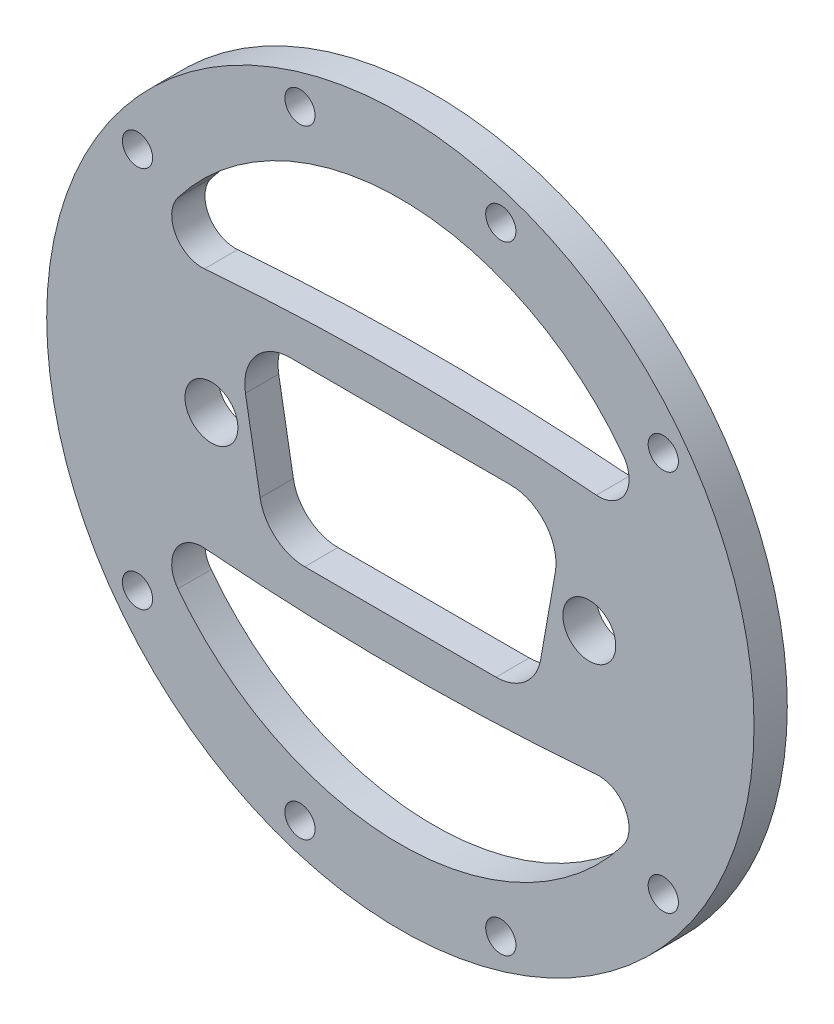
ISO-10303-21;
HEADER;
FILE_DESCRIPTION(('STEP AP214'),'2;1');
FILE_NAME('part.step','',(''),(''),'','','');
FILE_SCHEMA(('AUTOMOTIVE_DESIGN { 1 0 10303 214 1 1 1 1 }'));
ENDSEC;
DATA;
#1=APPLICATION_CONTEXT('core data for automotive mechanical design processes');
#2=APPLICATION_PROTOCOL_DEFINITION('international standard','automotive_design',2000,#1);
#3=PRODUCT_CONTEXT('',#1,'mechanical');
#4=PRODUCT('Part','Part','',(#3));
#5=PRODUCT_RELATED_PRODUCT_CATEGORY('part','',(#4));
#6=PRODUCT_DEFINITION_FORMATION('','',#4);
#7=PRODUCT_DEFINITION_CONTEXT('part definition',#1,'design');
#8=PRODUCT_DEFINITION('design','',#6,#7);
#9=PRODUCT_DEFINITION_SHAPE('','',#8);
#10=(LENGTH_UNIT() NAMED_UNIT(*) SI_UNIT(.MILLI.,.METRE.));
#11=(NAMED_UNIT(*) PLANE_ANGLE_UNIT() SI_UNIT($,.RADIAN.));
#12=(NAMED_UNIT(*) SI_UNIT($,.STERADIAN.) SOLID_ANGLE_UNIT());
#13=UNCERTAINTY_MEASURE_WITH_UNIT(LENGTH_MEASURE(1.E-05),#10,'distance_accuracy_value','');
#14=(GEOMETRIC_REPRESENTATION_CONTEXT(3) GLOBAL_UNCERTAINTY_ASSIGNED_CONTEXT((#13)) GLOBAL_UNIT_ASSIGNED_CONTEXT((#10,
#11,#12)) REPRESENTATION_CONTEXT('',''));
#15=CARTESIAN_POINT('',(0.,0.,0.));
#16=DIRECTION('',(0.,0.,1.));
#17=DIRECTION('',(1.,0.,0.));
#18=AXIS2_PLACEMENT_3D('',#15,#16,#17);
#19=CARTESIAN_POINT('',(0.,0.,2.2));
#20=DIRECTION('',(0.,0.,1.));
#21=DIRECTION('',(1.,0.,0.));
#22=AXIS2_PLACEMENT_3D('',#19,#20,#21);
#23=PLANE('',#22);
#24=CARTESIAN_POINT('',(7.29557674096338,2.75,2.2));
#25=DIRECTION('',(0.,0.,1.));
#26=DIRECTION('',(-1.,0.,0.));
#27=AXIS2_PLACEMENT_3D('',#24,#25,#26);
#28=CIRCLE('',#27,3.);
#29=CARTESIAN_POINT('',(10.25,2.2290554669992,2.2));
#30=VERTEX_POINT('',#29);
#31=CARTESIAN_POINT('',(7.29557674096338,5.75,2.2));
#32=VERTEX_POINT('',#31);
#33=EDGE_CURVE('E55',#30,#32,#28,.T.);
#34=ORIENTED_EDGE('',*,*,#33,.F.);
#35=DIRECTION('',(0.173648177666934,0.984807753012207,0.));
#36=VECTOR('',#35,1.);
#37=CARTESIAN_POINT('',(10.25,2.2290554669992,2.2));
#38=LINE('',#37,#36);
#39=CARTESIAN_POINT('',(9.28020160610342,-3.2709445330008,2.2));
#40=VERTEX_POINT('',#39);
#41=EDGE_CURVE('E175',#40,#30,#38,.T.);
#42=ORIENTED_EDGE('',*,*,#41,.F.);
#43=CARTESIAN_POINT('',(6.3257783470668,-2.75,2.2));
#44=DIRECTION('',(0.,0.,1.));
#45=DIRECTION('',(1.,0.,0.));
#46=AXIS2_PLACEMENT_3D('',#43,#44,#45);
#47=CIRCLE('',#46,3.);
#48=CARTESIAN_POINT('',(6.3257783470668,-5.75,2.2));
#49=VERTEX_POINT('',#48);
#50=EDGE_CURVE('E179',#49,#40,#47,.T.);
#51=ORIENTED_EDGE('',*,*,#50,.F.);
#52=DIRECTION('',(1.,0.,0.));
#53=VECTOR('',#52,1.);
#54=CARTESIAN_POINT('',(-6.3257783470668,-5.75,2.2));
#55=LINE('',#54,#53);
#56=CARTESIAN_POINT('',(-6.3257783470668,-5.75,2.2));
#57=VERTEX_POINT('',#56);
#58=EDGE_CURVE('E218',#57,#49,#55,.T.);
#59=ORIENTED_EDGE('',*,*,#58,.F.);
#60=CARTESIAN_POINT('',(-6.3257783470668,-2.75,2.2));
#61=DIRECTION('',(0.,0.,1.));
#62=DIRECTION('',(1.,0.,0.));
#63=AXIS2_PLACEMENT_3D('',#60,#61,#62);
#64=CIRCLE('',#63,3.);
#65=CARTESIAN_POINT('',(-9.28020160610342,-3.2709445330008,2.2));
#66=VERTEX_POINT('',#65);
#67=EDGE_CURVE('E214',#66,#57,#64,.T.);
#68=ORIENTED_EDGE('',*,*,#67,.F.);
#69=DIRECTION('',(0.173648177666934,-0.984807753012207,0.));
#70=VECTOR('',#69,1.);
#71=CARTESIAN_POINT('',(-10.25,2.2290554669992,2.2));
#72=LINE('',#71,#70);
#73=CARTESIAN_POINT('',(-10.25,2.2290554669992,2.2));
#74=VERTEX_POINT('',#73);
#75=EDGE_CURVE('E210',#74,#66,#72,.T.);
#76=ORIENTED_EDGE('',*,*,#75,.F.);
#77=CARTESIAN_POINT('',(-7.29557674096338,2.75,2.2));
#78=DIRECTION('',(0.,0.,1.));
#79=DIRECTION('',(1.,0.,0.));
#80=AXIS2_PLACEMENT_3D('',#77,#78,#79);
#81=CIRCLE('',#80,3.);
#82=CARTESIAN_POINT('',(-7.29557674096338,5.75,2.2));
#83=VERTEX_POINT('',#82);
#84=EDGE_CURVE('E206',#83,#74,#81,.T.);
#85=ORIENTED_EDGE('',*,*,#84,.F.);
#86=DIRECTION('',(-1.,0.,0.));
#87=VECTOR('',#86,1.);
#88=CARTESIAN_POINT('',(-7.29557674096338,5.75,2.2));
#89=LINE('',#88,#87);
#90=EDGE_CURVE('E203',#32,#83,#89,.T.);
#91=ORIENTED_EDGE('',*,*,#90,.F.);
#92=EDGE_LOOP('',(#34,#42,#51,#59,#68,#76,#85,#91));
#93=FACE_BOUND('',#92,.T.);
#94=CARTESIAN_POINT('',(-12.5,0.,2.2));
#95=DIRECTION('',(0.,0.,1.));
#96=DIRECTION('',(-1.,0.,0.));
#97=AXIS2_PLACEMENT_3D('',#94,#95,#96);
#98=CIRCLE('',#97,1.75);
#99=CARTESIAN_POINT('',(-14.25,0.,2.2));
#100=VERTEX_POINT('',#99);
#101=EDGE_CURVE('E228',#100,#100,#98,.T.);
#102=ORIENTED_EDGE('',*,*,#101,.F.);
#103=EDGE_LOOP('',(#102));
#104=FACE_BOUND('',#103,.T.);
#105=CARTESIAN_POINT('',(12.5,0.,2.2));
#106=DIRECTION('',(0.,0.,1.));
#107=DIRECTION('',(1.,0.,0.));
#108=AXIS2_PLACEMENT_3D('',#105,#106,#107);
#109=CIRCLE('',#108,1.75);
#110=CARTESIAN_POINT('',(14.25,0.,2.2));
#111=VERTEX_POINT('',#110);
#112=EDGE_CURVE('E250',#111,#111,#109,.T.);
#113=ORIENTED_EDGE('',*,*,#112,.F.);
#114=EDGE_LOOP('',(#113));
#115=FACE_BOUND('',#114,.T.);
#116=CARTESIAN_POINT('',(-17.3938653790616,-12.6373829242879,2.2));
#117=DIRECTION('',(0.,0.,1.));
#118=DIRECTION('',(1.,0.,0.));
#119=AXIS2_PLACEMENT_3D('',#116,#117,#118);
#120=CIRCLE('',#119,1.);
#121=CARTESIAN_POINT('',(-16.3938653790616,-12.6373829242879,2.2));
#122=VERTEX_POINT('',#121);
#123=EDGE_CURVE('E270',#122,#122,#120,.T.);
#124=ORIENTED_EDGE('',*,*,#123,.F.);
#125=EDGE_LOOP('',(#124));
#126=FACE_BOUND('',#125,.T.);
#127=CARTESIAN_POINT('',(6.6438653790611,-20.4477151003459,2.2));
#128=DIRECTION('',(0.,0.,1.));
#129=DIRECTION('',(1.,0.,0.));
#130=AXIS2_PLACEMENT_3D('',#127,#128,#129);
#131=CIRCLE('',#130,1.);
#132=CARTESIAN_POINT('',(7.6438653790611,-20.4477151003459,2.2));
#133=VERTEX_POINT('',#132);
#134=EDGE_CURVE('E286',#133,#133,#131,.T.);
#135=ORIENTED_EDGE('',*,*,#134,.F.);
#136=EDGE_LOOP('',(#135));
#137=FACE_BOUND('',#136,.T.);
#138=CARTESIAN_POINT('',(17.3938653790615,12.637382924288,2.2));
#139=DIRECTION('',(0.,0.,1.));
#140=DIRECTION('',(1.,0.,0.));
#141=AXIS2_PLACEMENT_3D('',#138,#139,#140);
#142=CIRCLE('',#141,1.);
#143=CARTESIAN_POINT('',(18.3938653790615,12.637382924288,2.2));
#144=VERTEX_POINT('',#143);
#145=EDGE_CURVE('E302',#144,#144,#142,.T.);
#146=ORIENTED_EDGE('',*,*,#145,.F.);
#147=EDGE_LOOP('',(#146));
#148=FACE_BOUND('',#147,.T.);
#149=CARTESIAN_POINT('',(6.64386537906153,20.4477151003458,2.2));
#150=DIRECTION('',(0.,0.,1.));
#151=DIRECTION('',(1.,0.,0.));
#152=AXIS2_PLACEMENT_3D('',#149,#150,#151);
#153=CIRCLE('',#152,0.999999999999999);
#154=CARTESIAN_POINT('',(7.64386537906152,20.4477151003458,2.2));
#155=VERTEX_POINT('',#154);
#156=EDGE_CURVE('E318',#155,#155,#153,.T.);
#157=ORIENTED_EDGE('',*,*,#156,.F.);
#158=EDGE_LOOP('',(#157));
#159=FACE_BOUND('',#158,.T.);
#160=CARTESIAN_POINT('',(0.,0.,2.2));
#161=DIRECTION('',(0.,0.,1.));
#162=DIRECTION('',(1.,0.,0.));
#163=AXIS2_PLACEMENT_3D('',#160,#161,#162);
#164=CIRCLE('',#163,23.4);
#165=CARTESIAN_POINT('',(23.4,0.,2.2));
#166=VERTEX_POINT('',#165);
#167=EDGE_CURVE('E11',#166,#166,#164,.T.);
#168=ORIENTED_EDGE('',*,*,#167,.T.);
#169=EDGE_LOOP('',(#168));
#170=FACE_BOUND('',#169,.T.);
#171=CARTESIAN_POINT('',(13.12941512368,9.99342076118538,2.2));
#172=DIRECTION('',(0.,0.,1.));
#173=DIRECTION('',(1.,0.,0.));
#174=AXIS2_PLACEMENT_3D('',#171,#172,#173);
#175=CIRCLE('',#174,1.99999999999987);
#176=CARTESIAN_POINT('',(12.9673235789432,8.00000000000015,2.2));
#177=VERTEX_POINT('',#176);
#178=CARTESIAN_POINT('',(14.7208593810955,11.2047444898137,2.2));
#179=VERTEX_POINT('',#178);
#180=EDGE_CURVE('E372',#177,#179,#175,.T.);
#181=ORIENTED_EDGE('',*,*,#180,.F.);
#182=CARTESIAN_POINT('',(0.,-151.473660894829,2.2));
#183=DIRECTION('',(0.,0.,-1.));
#184=DIRECTION('',(-1.,0.,0.));
#185=AXIS2_PLACEMENT_3D('',#182,#183,#184);
#186=CIRCLE('',#185,160.);
#187=CARTESIAN_POINT('',(-12.9673235789432,8.00000000000015,2.2));
#188=VERTEX_POINT('',#187);
#189=EDGE_CURVE('E369',#188,#177,#186,.T.);
#190=ORIENTED_EDGE('',*,*,#189,.F.);
#191=CARTESIAN_POINT('',(-13.12941512368,9.99342076118538,2.2));
#192=DIRECTION('',(0.,0.,1.));
#193=DIRECTION('',(-1.,0.,0.));
#194=AXIS2_PLACEMENT_3D('',#191,#192,#193);
#195=CIRCLE('',#194,1.99999999999987);
#196=CARTESIAN_POINT('',(-14.7208593810956,11.2047444898138,2.2));
#197=VERTEX_POINT('',#196);
#198=EDGE_CURVE('E380',#197,#188,#195,.T.);
#199=ORIENTED_EDGE('',*,*,#198,.F.);
#200=CARTESIAN_POINT('',(0.,0.,2.2));
#201=DIRECTION('',(0.,0.,1.));
#202=DIRECTION('',(1.,0.,0.));
#203=AXIS2_PLACEMENT_3D('',#200,#201,#202);
#204=CIRCLE('',#203,18.5);
#205=EDGE_CURVE('E376',#179,#197,#204,.T.);
#206=ORIENTED_EDGE('',*,*,#205,.F.);
#207=EDGE_LOOP('',(#181,#190,#199,#206));
#208=FACE_BOUND('',#207,.T.);
#209=CARTESIAN_POINT('',(-13.12941512368,-9.99342076118538,2.2));
#210=DIRECTION('',(0.,0.,1.));
#211=DIRECTION('',(1.,0.,0.));
#212=AXIS2_PLACEMENT_3D('',#209,#210,#211);
#213=CIRCLE('',#212,1.99999999999987);
#214=CARTESIAN_POINT('',(-12.9673235789432,-8.00000000000015,2.2));
#215=VERTEX_POINT('',#214);
#216=CARTESIAN_POINT('',(-14.7208593810956,-11.2047444898138,2.2));
#217=VERTEX_POINT('',#216);
#218=EDGE_CURVE('E329',#215,#217,#213,.T.);
#219=ORIENTED_EDGE('',*,*,#218,.F.);
#220=CARTESIAN_POINT('',(0.,151.473660894829,2.2));
#221=DIRECTION('',(0.,0.,-1.));
#222=DIRECTION('',(1.,0.,0.));
#223=AXIS2_PLACEMENT_3D('',#220,#221,#222);
#224=CIRCLE('',#223,160.);
#225=CARTESIAN_POINT('',(12.9673235789432,-8.00000000000015,2.2));
#226=VERTEX_POINT('',#225);
#227=EDGE_CURVE('E326',#226,#215,#224,.T.);
#228=ORIENTED_EDGE('',*,*,#227,.F.);
#229=CARTESIAN_POINT('',(13.12941512368,-9.99342076118538,2.2));
#230=DIRECTION('',(0.,0.,1.));
#231=DIRECTION('',(-1.,0.,0.));
#232=AXIS2_PLACEMENT_3D('',#229,#230,#231);
#233=CIRCLE('',#232,1.99999999999987);
#234=CARTESIAN_POINT('',(14.7208593810956,-11.2047444898138,2.2));
#235=VERTEX_POINT('',#234);
#236=EDGE_CURVE('E337',#235,#226,#233,.T.);
#237=ORIENTED_EDGE('',*,*,#236,.F.);
#238=CARTESIAN_POINT('',(0.,0.,2.2));
#239=DIRECTION('',(0.,0.,1.));
#240=DIRECTION('',(1.,0.,0.));
#241=AXIS2_PLACEMENT_3D('',#238,#239,#240);
#242=CIRCLE('',#241,18.5);
#243=EDGE_CURVE('E333',#217,#235,#242,.T.);
#244=ORIENTED_EDGE('',*,*,#243,.F.);
#245=EDGE_LOOP('',(#219,#228,#237,#244));
#246=FACE_BOUND('',#245,.T.);
#247=CARTESIAN_POINT('',(-6.64386537906124,20.4477151003458,2.2));
#248=DIRECTION('',(0.,0.,1.));
#249=DIRECTION('',(1.,0.,0.));
#250=AXIS2_PLACEMENT_3D('',#247,#248,#249);
#251=CIRCLE('',#250,1.);
#252=CARTESIAN_POINT('',(-5.64386537906124,20.4477151003458,2.2));
#253=VERTEX_POINT('',#252);
#254=EDGE_CURVE('E310',#253,#253,#251,.T.);
#255=ORIENTED_EDGE('',*,*,#254,.F.);
#256=EDGE_LOOP('',(#255));
#257=FACE_BOUND('',#256,.T.);
#258=CARTESIAN_POINT('',(17.3938653790612,-12.6373829242884,2.2));
#259=DIRECTION('',(0.,0.,1.));
#260=DIRECTION('',(1.,0.,0.));
#261=AXIS2_PLACEMENT_3D('',#258,#259,#260);
#262=CIRCLE('',#261,1.);
#263=CARTESIAN_POINT('',(18.3938653790612,-12.6373829242884,2.2));
#264=VERTEX_POINT('',#263);
#265=EDGE_CURVE('E294',#264,#264,#262,.T.);
#266=ORIENTED_EDGE('',*,*,#265,.F.);
#267=EDGE_LOOP('',(#266));
#268=FACE_BOUND('',#267,.T.);
#269=CARTESIAN_POINT('',(-6.64386537906167,-20.4477151003457,2.2));
#270=DIRECTION('',(0.,0.,1.));
#271=DIRECTION('',(1.,0.,0.));
#272=AXIS2_PLACEMENT_3D('',#269,#270,#271);
#273=CIRCLE('',#272,1.);
#274=CARTESIAN_POINT('',(-5.64386537906167,-20.4477151003457,2.2));
#275=VERTEX_POINT('',#274);
#276=EDGE_CURVE('E278',#275,#275,#273,.T.);
#277=ORIENTED_EDGE('',*,*,#276,.F.);
#278=EDGE_LOOP('',(#277));
#279=FACE_BOUND('',#278,.T.);
#280=CARTESIAN_POINT('',(-17.3938653790611,12.6373829242885,2.2));
#281=DIRECTION('',(0.,0.,1.));
#282=DIRECTION('',(1.,0.,0.));
#283=AXIS2_PLACEMENT_3D('',#280,#281,#282);
#284=CIRCLE('',#283,1.00000000000001);
#285=CARTESIAN_POINT('',(-16.3938653790611,12.6373829242885,2.2));
#286=VERTEX_POINT('',#285);
#287=EDGE_CURVE('E262',#286,#286,#284,.T.);
#288=ORIENTED_EDGE('',*,*,#287,.F.);
#289=EDGE_LOOP('',(#288));
#290=FACE_BOUND('',#289,.T.);
#291=ADVANCED_FACE('F39',(#93,#104,#115,#126,#137,#148,#159,#170,#208,#246,#257,#268,#279,#290),
#23,.T.);
#292=CARTESIAN_POINT('',(0.,0.,0.));
#293=DIRECTION('',(0.,0.,1.));
#294=DIRECTION('',(1.,0.,0.));
#295=AXIS2_PLACEMENT_3D('',#292,#293,#294);
#296=PLANE('',#295);
#297=DIRECTION('',(0.173648177666934,0.984807753012207,0.));
#298=VECTOR('',#297,1.);
#299=CARTESIAN_POINT('',(10.25,2.2290554669992,0.));
#300=LINE('',#299,#298);
#301=CARTESIAN_POINT('',(9.28020160610342,-3.2709445330008,0.));
#302=VERTEX_POINT('',#301);
#303=CARTESIAN_POINT('',(10.25,2.2290554669992,0.));
#304=VERTEX_POINT('',#303);
#305=EDGE_CURVE('E162',#302,#304,#300,.T.);
#306=ORIENTED_EDGE('',*,*,#305,.T.);
#307=CARTESIAN_POINT('',(7.29557674096338,2.75,0.));
#308=DIRECTION('',(0.,0.,1.));
#309=DIRECTION('',(-1.,0.,0.));
#310=AXIS2_PLACEMENT_3D('',#307,#308,#309);
#311=CIRCLE('',#310,3.);
#312=CARTESIAN_POINT('',(7.29557674096338,5.75,0.));
#313=VERTEX_POINT('',#312);
#314=EDGE_CURVE('E155',#304,#313,#311,.T.);
#315=ORIENTED_EDGE('',*,*,#314,.T.);
#316=DIRECTION('',(-1.,0.,0.));
#317=VECTOR('',#316,1.);
#318=CARTESIAN_POINT('',(-7.29557674096338,5.75,0.));
#319=LINE('',#318,#317);
#320=CARTESIAN_POINT('',(-7.29557674096338,5.75,0.));
#321=VERTEX_POINT('',#320);
#322=EDGE_CURVE('E165',#313,#321,#319,.T.);
#323=ORIENTED_EDGE('',*,*,#322,.T.);
#324=CARTESIAN_POINT('',(-7.29557674096338,2.75,0.));
#325=DIRECTION('',(0.,0.,1.));
#326=DIRECTION('',(1.,0.,0.));
#327=AXIS2_PLACEMENT_3D('',#324,#325,#326);
#328=CIRCLE('',#327,3.);
#329=CARTESIAN_POINT('',(-10.25,2.2290554669992,0.));
#330=VERTEX_POINT('',#329);
#331=EDGE_CURVE('E63',#321,#330,#328,.T.);
#332=ORIENTED_EDGE('',*,*,#331,.T.);
#333=DIRECTION('',(0.173648177666934,-0.984807753012207,0.));
#334=VECTOR('',#333,1.);
#335=CARTESIAN_POINT('',(-10.25,2.2290554669992,0.));
#336=LINE('',#335,#334);
#337=CARTESIAN_POINT('',(-9.28020160610342,-3.2709445330008,0.));
#338=VERTEX_POINT('',#337);
#339=EDGE_CURVE('E184',#330,#338,#336,.T.);
#340=ORIENTED_EDGE('',*,*,#339,.T.);
#341=CARTESIAN_POINT('',(-6.3257783470668,-2.75,0.));
#342=DIRECTION('',(0.,0.,1.));
#343=DIRECTION('',(1.,0.,0.));
#344=AXIS2_PLACEMENT_3D('',#341,#342,#343);
#345=CIRCLE('',#344,3.);
#346=CARTESIAN_POINT('',(-6.3257783470668,-5.75,0.));
#347=VERTEX_POINT('',#346);
#348=EDGE_CURVE('E188',#338,#347,#345,.T.);
#349=ORIENTED_EDGE('',*,*,#348,.T.);
#350=DIRECTION('',(1.,0.,0.));
#351=VECTOR('',#350,1.);
#352=CARTESIAN_POINT('',(-6.3257783470668,-5.75,0.));
#353=LINE('',#352,#351);
#354=CARTESIAN_POINT('',(6.3257783470668,-5.75,0.));
#355=VERTEX_POINT('',#354);
#356=EDGE_CURVE('E192',#347,#355,#353,.T.);
#357=ORIENTED_EDGE('',*,*,#356,.T.);
#358=CARTESIAN_POINT('',(6.3257783470668,-2.75,0.));
#359=DIRECTION('',(0.,0.,1.));
#360=DIRECTION('',(1.,0.,0.));
#361=AXIS2_PLACEMENT_3D('',#358,#359,#360);
#362=CIRCLE('',#361,3.);
#363=EDGE_CURVE('E196',#355,#302,#362,.T.);
#364=ORIENTED_EDGE('',*,*,#363,.T.);
#365=EDGE_LOOP('',(#306,#315,#323,#332,#340,#349,#357,#364));
#366=FACE_BOUND('',#365,.T.);
#367=CARTESIAN_POINT('',(-12.5,0.,0.));
#368=DIRECTION('',(0.,0.,1.));
#369=DIRECTION('',(-1.,0.,0.));
#370=AXIS2_PLACEMENT_3D('',#367,#368,#369);
#371=CIRCLE('',#370,1.75);
#372=CARTESIAN_POINT('',(-14.25,0.,0.));
#373=VERTEX_POINT('',#372);
#374=EDGE_CURVE('E246',#373,#373,#371,.T.);
#375=ORIENTED_EDGE('',*,*,#374,.T.);
#376=EDGE_LOOP('',(#375));
#377=FACE_BOUND('',#376,.T.);
#378=CARTESIAN_POINT('',(12.5,0.,0.));
#379=DIRECTION('',(0.,0.,1.));
#380=DIRECTION('',(1.,0.,0.));
#381=AXIS2_PLACEMENT_3D('',#378,#379,#380);
#382=CIRCLE('',#381,1.75);
#383=CARTESIAN_POINT('',(14.25,0.,0.));
#384=VERTEX_POINT('',#383);
#385=EDGE_CURVE('E254',#384,#384,#382,.T.);
#386=ORIENTED_EDGE('',*,*,#385,.T.);
#387=EDGE_LOOP('',(#386));
#388=FACE_BOUND('',#387,.T.);
#389=CARTESIAN_POINT('',(0.,-151.473660894829,0.));
#390=DIRECTION('',(0.,0.,-1.));
#391=DIRECTION('',(-1.,0.,0.));
#392=AXIS2_PLACEMENT_3D('',#389,#390,#391);
#393=CIRCLE('',#392,160.);
#394=CARTESIAN_POINT('',(-12.9673235789432,8.00000000000015,0.));
#395=VERTEX_POINT('',#394);
#396=CARTESIAN_POINT('',(12.9673235789432,8.00000000000015,0.));
#397=VERTEX_POINT('',#396);
#398=EDGE_CURVE('E368',#395,#397,#393,.T.);
#399=ORIENTED_EDGE('',*,*,#398,.T.);
#400=CARTESIAN_POINT('',(13.12941512368,9.99342076118538,0.));
#401=DIRECTION('',(0.,0.,1.));
#402=DIRECTION('',(1.,0.,0.));
#403=AXIS2_PLACEMENT_3D('',#400,#401,#402);
#404=CIRCLE('',#403,1.99999999999987);
#405=CARTESIAN_POINT('',(14.7208593810955,11.2047444898137,0.));
#406=VERTEX_POINT('',#405);
#407=EDGE_CURVE('E387',#397,#406,#404,.T.);
#408=ORIENTED_EDGE('',*,*,#407,.T.);
#409=CARTESIAN_POINT('',(0.,0.,0.));
#410=DIRECTION('',(0.,0.,1.));
#411=DIRECTION('',(1.,0.,0.));
#412=AXIS2_PLACEMENT_3D('',#409,#410,#411);
#413=CIRCLE('',#412,18.5);
#414=CARTESIAN_POINT('',(-14.7208593810956,11.2047444898138,0.));
#415=VERTEX_POINT('',#414);
#416=EDGE_CURVE('E391',#406,#415,#413,.T.);
#417=ORIENTED_EDGE('',*,*,#416,.T.);
#418=CARTESIAN_POINT('',(-13.12941512368,9.99342076118538,0.));
#419=DIRECTION('',(0.,0.,1.));
#420=DIRECTION('',(-1.,0.,0.));
#421=AXIS2_PLACEMENT_3D('',#418,#419,#420);
#422=CIRCLE('',#421,1.99999999999987);
#423=EDGE_CURVE('E373',#415,#395,#422,.T.);
#424=ORIENTED_EDGE('',*,*,#423,.T.);
#425=EDGE_LOOP('',(#399,#408,#417,#424));
#426=FACE_BOUND('',#425,.T.);
#427=CARTESIAN_POINT('',(0.,0.,0.));
#428=DIRECTION('',(0.,0.,1.));
#429=DIRECTION('',(1.,0.,0.));
#430=AXIS2_PLACEMENT_3D('',#427,#428,#429);
#431=CIRCLE('',#430,23.4);
#432=CARTESIAN_POINT('',(23.4,0.,0.));
#433=VERTEX_POINT('',#432);
#434=EDGE_CURVE('E43',#433,#433,#431,.T.);
#435=ORIENTED_EDGE('',*,*,#434,.F.);
#436=EDGE_LOOP('',(#435));
#437=FACE_BOUND('',#436,.T.);
#438=CARTESIAN_POINT('',(0.,151.473660894829,0.));
#439=DIRECTION('',(0.,0.,-1.));
#440=DIRECTION('',(1.,0.,0.));
#441=AXIS2_PLACEMENT_3D('',#438,#439,#440);
#442=CIRCLE('',#441,160.);
#443=CARTESIAN_POINT('',(12.9673235789432,-8.00000000000015,0.));
#444=VERTEX_POINT('',#443);
#445=CARTESIAN_POINT('',(-12.9673235789432,-8.00000000000015,0.));
#446=VERTEX_POINT('',#445);
#447=EDGE_CURVE('E322',#444,#446,#442,.T.);
#448=ORIENTED_EDGE('',*,*,#447,.T.);
#449=CARTESIAN_POINT('',(-13.12941512368,-9.99342076118538,0.));
#450=DIRECTION('',(0.,0.,1.));
#451=DIRECTION('',(1.,0.,0.));
#452=AXIS2_PLACEMENT_3D('',#449,#450,#451);
#453=CIRCLE('',#452,1.99999999999987);
#454=CARTESIAN_POINT('',(-14.7208593810956,-11.2047444898138,0.));
#455=VERTEX_POINT('',#454);
#456=EDGE_CURVE('E344',#446,#455,#453,.T.);
#457=ORIENTED_EDGE('',*,*,#456,.T.);
#458=CARTESIAN_POINT('',(0.,0.,0.));
#459=DIRECTION('',(0.,0.,1.));
#460=DIRECTION('',(1.,0.,0.));
#461=AXIS2_PLACEMENT_3D('',#458,#459,#460);
#462=CIRCLE('',#461,18.5);
#463=CARTESIAN_POINT('',(14.7208593810955,-11.2047444898137,0.));
#464=VERTEX_POINT('',#463);
#465=EDGE_CURVE('E348',#455,#464,#462,.T.);
#466=ORIENTED_EDGE('',*,*,#465,.T.);
#467=CARTESIAN_POINT('',(13.12941512368,-9.99342076118538,0.));
#468=DIRECTION('',(0.,0.,1.));
#469=DIRECTION('',(-1.,0.,0.));
#470=AXIS2_PLACEMENT_3D('',#467,#468,#469);
#471=CIRCLE('',#470,1.99999999999987);
#472=EDGE_CURVE('E330',#464,#444,#471,.T.);
#473=ORIENTED_EDGE('',*,*,#472,.T.);
#474=EDGE_LOOP('',(#448,#457,#466,#473));
#475=FACE_BOUND('',#474,.T.);
#476=CARTESIAN_POINT('',(6.64386537906153,20.4477151003458,0.));
#477=DIRECTION('',(0.,0.,1.));
#478=DIRECTION('',(1.,0.,0.));
#479=AXIS2_PLACEMENT_3D('',#476,#477,#478);
#480=CIRCLE('',#479,0.999999999999999);
#481=CARTESIAN_POINT('',(7.64386537906152,20.4477151003458,0.));
#482=VERTEX_POINT('',#481);
#483=EDGE_CURVE('E314',#482,#482,#480,.T.);
#484=ORIENTED_EDGE('',*,*,#483,.T.);
#485=EDGE_LOOP('',(#484));
#486=FACE_BOUND('',#485,.T.);
#487=CARTESIAN_POINT('',(-6.64386537906124,20.4477151003458,0.));
#488=DIRECTION('',(0.,0.,1.));
#489=DIRECTION('',(1.,0.,0.));
#490=AXIS2_PLACEMENT_3D('',#487,#488,#489);
#491=CIRCLE('',#490,1.);
#492=CARTESIAN_POINT('',(-5.64386537906124,20.4477151003458,0.));
#493=VERTEX_POINT('',#492);
#494=EDGE_CURVE('E306',#493,#493,#491,.T.);
#495=ORIENTED_EDGE('',*,*,#494,.T.);
#496=EDGE_LOOP('',(#495));
#497=FACE_BOUND('',#496,.T.);
#498=CARTESIAN_POINT('',(17.3938653790615,12.637382924288,0.));
#499=DIRECTION('',(0.,0.,1.));
#500=DIRECTION('',(1.,0.,0.));
#501=AXIS2_PLACEMENT_3D('',#498,#499,#500);
#502=CIRCLE('',#501,1.);
#503=CARTESIAN_POINT('',(18.3938653790615,12.637382924288,0.));
#504=VERTEX_POINT('',#503);
#505=EDGE_CURVE('E298',#504,#504,#502,.T.);
#506=ORIENTED_EDGE('',*,*,#505,.T.);
#507=EDGE_LOOP('',(#506));
#508=FACE_BOUND('',#507,.T.);
#509=CARTESIAN_POINT('',(17.3938653790612,-12.6373829242884,0.));
#510=DIRECTION('',(0.,0.,1.));
#511=DIRECTION('',(1.,0.,0.));
#512=AXIS2_PLACEMENT_3D('',#509,#510,#511);
#513=CIRCLE('',#512,1.);
#514=CARTESIAN_POINT('',(18.3938653790612,-12.6373829242884,0.));
#515=VERTEX_POINT('',#514);
#516=EDGE_CURVE('E290',#515,#515,#513,.T.);
#517=ORIENTED_EDGE('',*,*,#516,.T.);
#518=EDGE_LOOP('',(#517));
#519=FACE_BOUND('',#518,.T.);
#520=CARTESIAN_POINT('',(6.6438653790611,-20.4477151003459,0.));
#521=DIRECTION('',(0.,0.,1.));
#522=DIRECTION('',(1.,0.,0.));
#523=AXIS2_PLACEMENT_3D('',#520,#521,#522);
#524=CIRCLE('',#523,1.);
#525=CARTESIAN_POINT('',(7.6438653790611,-20.4477151003459,0.));
#526=VERTEX_POINT('',#525);
#527=EDGE_CURVE('E282',#526,#526,#524,.T.);
#528=ORIENTED_EDGE('',*,*,#527,.T.);
#529=EDGE_LOOP('',(#528));
#530=FACE_BOUND('',#529,.T.);
#531=CARTESIAN_POINT('',(-6.64386537906167,-20.4477151003457,0.));
#532=DIRECTION('',(0.,0.,1.));
#533=DIRECTION('',(1.,0.,0.));
#534=AXIS2_PLACEMENT_3D('',#531,#532,#533);
#535=CIRCLE('',#534,1.);
#536=CARTESIAN_POINT('',(-5.64386537906167,-20.4477151003457,0.));
#537=VERTEX_POINT('',#536);
#538=EDGE_CURVE('E274',#537,#537,#535,.T.);
#539=ORIENTED_EDGE('',*,*,#538,.T.);
#540=EDGE_LOOP('',(#539));
#541=FACE_BOUND('',#540,.T.);
#542=CARTESIAN_POINT('',(-17.3938653790616,-12.6373829242879,0.));
#543=DIRECTION('',(0.,0.,1.));
#544=DIRECTION('',(1.,0.,0.));
#545=AXIS2_PLACEMENT_3D('',#542,#543,#544);
#546=CIRCLE('',#545,1.);
#547=CARTESIAN_POINT('',(-16.3938653790616,-12.6373829242879,0.));
#548=VERTEX_POINT('',#547);
#549=EDGE_CURVE('E266',#548,#548,#546,.T.);
#550=ORIENTED_EDGE('',*,*,#549,.T.);
#551=EDGE_LOOP('',(#550));
#552=FACE_BOUND('',#551,.T.);
#553=CARTESIAN_POINT('',(-17.3938653790611,12.6373829242885,0.));
#554=DIRECTION('',(0.,0.,1.));
#555=DIRECTION('',(1.,0.,0.));
#556=AXIS2_PLACEMENT_3D('',#553,#554,#555);
#557=CIRCLE('',#556,1.00000000000001);
#558=CARTESIAN_POINT('',(-16.3938653790611,12.6373829242885,0.));
#559=VERTEX_POINT('',#558);
#560=EDGE_CURVE('E258',#559,#559,#557,.T.);
#561=ORIENTED_EDGE('',*,*,#560,.T.);
#562=EDGE_LOOP('',(#561));
#563=FACE_BOUND('',#562,.T.);
#564=ADVANCED_FACE('F170',(#366,#377,#388,#426,#437,#475,#486,#497,#508,#519,#530,#541,#552,
#563),#296,.F.);
#565=CARTESIAN_POINT('',(0.,0.,2.2));
#566=DIRECTION('',(0.,0.,-1.));
#567=DIRECTION('',(-1.,0.,0.));
#568=AXIS2_PLACEMENT_3D('',#565,#566,#567);
#569=CYLINDRICAL_SURFACE('',#568,23.4);
#570=ORIENTED_EDGE('',*,*,#167,.F.);
#571=EDGE_LOOP('',(#570));
#572=FACE_BOUND('',#571,.T.);
#573=ORIENTED_EDGE('',*,*,#434,.T.);
#574=EDGE_LOOP('',(#573));
#575=FACE_BOUND('',#574,.T.);
#576=ADVANCED_FACE('F41',(#572,#575),#569,.T.);
#577=CARTESIAN_POINT('',(0.,-151.473660894829,2.2));
#578=DIRECTION('',(0.,0.,-1.));
#579=DIRECTION('',(-1.,0.,0.));
#580=AXIS2_PLACEMENT_3D('',#577,#578,#579);
#581=CYLINDRICAL_SURFACE('',#580,160.);
#582=ORIENTED_EDGE('',*,*,#398,.F.);
#583=DIRECTION('',(0.,0.,-1.));
#584=VECTOR('',#583,1.);
#585=CARTESIAN_POINT('',(-12.9673235789432,8.00000000000015,2.2));
#586=LINE('',#585,#584);
#587=EDGE_CURVE('E383',#188,#395,#586,.T.);
#588=ORIENTED_EDGE('',*,*,#587,.F.);
#589=ORIENTED_EDGE('',*,*,#189,.T.);
#590=DIRECTION('',(0.,0.,-1.));
#591=VECTOR('',#590,1.);
#592=CARTESIAN_POINT('',(12.9673235789432,8.00000000000015,2.2));
#593=LINE('',#592,#591);
#594=EDGE_CURVE('E407',#177,#397,#593,.T.);
#595=ORIENTED_EDGE('',*,*,#594,.T.);
#596=EDGE_LOOP('',(#582,#588,#589,#595));
#597=FACE_BOUND('',#596,.T.);
#598=ADVANCED_FACE('F459',(#597),#581,.T.);
#599=CARTESIAN_POINT('',(13.12941512368,9.99342076118538,2.2));
#600=DIRECTION('',(0.,0.,-1.));
#601=DIRECTION('',(-1.,0.,0.));
#602=AXIS2_PLACEMENT_3D('',#599,#600,#601);
#603=CYLINDRICAL_SURFACE('',#602,1.99999999999987);
#604=ORIENTED_EDGE('',*,*,#407,.F.);
#605=ORIENTED_EDGE('',*,*,#594,.F.);
#606=ORIENTED_EDGE('',*,*,#180,.T.);
#607=DIRECTION('',(0.,0.,-1.));
#608=VECTOR('',#607,1.);
#609=CARTESIAN_POINT('',(14.7208593810955,11.2047444898137,2.2));
#610=LINE('',#609,#608);
#611=EDGE_CURVE('E404',#179,#406,#610,.T.);
#612=ORIENTED_EDGE('',*,*,#611,.T.);
#613=EDGE_LOOP('',(#604,#605,#606,#612));
#614=FACE_BOUND('',#613,.T.);
#615=ADVANCED_FACE('F462',(#614),#603,.F.);
#616=CARTESIAN_POINT('',(0.,0.,2.2));
#617=DIRECTION('',(0.,0.,-1.));
#618=DIRECTION('',(-1.,0.,0.));
#619=AXIS2_PLACEMENT_3D('',#616,#617,#618);
#620=CYLINDRICAL_SURFACE('',#619,18.5);
#621=ORIENTED_EDGE('',*,*,#416,.F.);
#622=ORIENTED_EDGE('',*,*,#611,.F.);
#623=ORIENTED_EDGE('',*,*,#205,.T.);
#624=DIRECTION('',(0.,0.,-1.));
#625=VECTOR('',#624,1.);
#626=CARTESIAN_POINT('',(-14.7208593810956,11.2047444898138,2.2));
#627=LINE('',#626,#625);
#628=EDGE_CURVE('E401',#197,#415,#627,.T.);
#629=ORIENTED_EDGE('',*,*,#628,.T.);
#630=EDGE_LOOP('',(#621,#622,#623,#629));
#631=FACE_BOUND('',#630,.T.);
#632=ADVANCED_FACE('F465',(#631),#620,.F.);
#633=CARTESIAN_POINT('',(-13.12941512368,9.99342076118538,2.2));
#634=DIRECTION('',(0.,0.,-1.));
#635=DIRECTION('',(-1.,0.,0.));
#636=AXIS2_PLACEMENT_3D('',#633,#634,#635);
#637=CYLINDRICAL_SURFACE('',#636,1.99999999999987);
#638=ORIENTED_EDGE('',*,*,#423,.F.);
#639=ORIENTED_EDGE('',*,*,#628,.F.);
#640=ORIENTED_EDGE('',*,*,#198,.T.);
#641=ORIENTED_EDGE('',*,*,#587,.T.);
#642=EDGE_LOOP('',(#638,#639,#640,#641));
#643=FACE_BOUND('',#642,.T.);
#644=ADVANCED_FACE('F469',(#643),#637,.F.);
#645=CARTESIAN_POINT('',(0.,151.473660894829,2.2));
#646=DIRECTION('',(0.,0.,-1.));
#647=DIRECTION('',(-1.,0.,0.));
#648=AXIS2_PLACEMENT_3D('',#645,#646,#647);
#649=CYLINDRICAL_SURFACE('',#648,160.);
#650=ORIENTED_EDGE('',*,*,#447,.F.);
#651=DIRECTION('',(0.,0.,-1.));
#652=VECTOR('',#651,1.);
#653=CARTESIAN_POINT('',(12.9673235789432,-8.00000000000015,2.2));
#654=LINE('',#653,#652);
#655=EDGE_CURVE('E340',#226,#444,#654,.T.);
#656=ORIENTED_EDGE('',*,*,#655,.F.);
#657=ORIENTED_EDGE('',*,*,#227,.T.);
#658=DIRECTION('',(0.,0.,-1.));
#659=VECTOR('',#658,1.);
#660=CARTESIAN_POINT('',(-12.9673235789432,-8.00000000000015,2.2));
#661=LINE('',#660,#659);
#662=EDGE_CURVE('E364',#215,#446,#661,.T.);
#663=ORIENTED_EDGE('',*,*,#662,.T.);
#664=EDGE_LOOP('',(#650,#656,#657,#663));
#665=FACE_BOUND('',#664,.T.);
#666=ADVANCED_FACE('F473',(#665),#649,.T.);
#667=CARTESIAN_POINT('',(-13.12941512368,-9.99342076118538,2.2));
#668=DIRECTION('',(0.,0.,-1.));
#669=DIRECTION('',(-1.,0.,0.));
#670=AXIS2_PLACEMENT_3D('',#667,#668,#669);
#671=CYLINDRICAL_SURFACE('',#670,1.99999999999987);
#672=ORIENTED_EDGE('',*,*,#456,.F.);
#673=ORIENTED_EDGE('',*,*,#662,.F.);
#674=ORIENTED_EDGE('',*,*,#218,.T.);
#675=DIRECTION('',(0.,0.,-1.));
#676=VECTOR('',#675,1.);
#677=CARTESIAN_POINT('',(-14.7208593810956,-11.2047444898138,2.2));
#678=LINE('',#677,#676);
#679=EDGE_CURVE('E361',#217,#455,#678,.T.);
#680=ORIENTED_EDGE('',*,*,#679,.T.);
#681=EDGE_LOOP('',(#672,#673,#674,#680));
#682=FACE_BOUND('',#681,.T.);
#683=ADVANCED_FACE('F477',(#682),#671,.F.);
#684=CARTESIAN_POINT('',(0.,0.,2.2));
#685=DIRECTION('',(0.,0.,-1.));
#686=DIRECTION('',(-1.,0.,0.));
#687=AXIS2_PLACEMENT_3D('',#684,#685,#686);
#688=CYLINDRICAL_SURFACE('',#687,18.5);
#689=ORIENTED_EDGE('',*,*,#465,.F.);
#690=ORIENTED_EDGE('',*,*,#679,.F.);
#691=ORIENTED_EDGE('',*,*,#243,.T.);
#692=DIRECTION('',(0.,0.,-1.));
#693=VECTOR('',#692,1.);
#694=CARTESIAN_POINT('',(14.7208593810955,-11.2047444898137,2.2));
#695=LINE('',#694,#693);
#696=EDGE_CURVE('E358',#235,#464,#695,.T.);
#697=ORIENTED_EDGE('',*,*,#696,.T.);
#698=EDGE_LOOP('',(#689,#690,#691,#697));
#699=FACE_BOUND('',#698,.T.);
#700=ADVANCED_FACE('F481',(#699),#688,.F.);
#701=CARTESIAN_POINT('',(13.12941512368,-9.99342076118538,2.2));
#702=DIRECTION('',(0.,0.,-1.));
#703=DIRECTION('',(-1.,0.,0.));
#704=AXIS2_PLACEMENT_3D('',#701,#702,#703);
#705=CYLINDRICAL_SURFACE('',#704,1.99999999999987);
#706=ORIENTED_EDGE('',*,*,#472,.F.);
#707=ORIENTED_EDGE('',*,*,#696,.F.);
#708=ORIENTED_EDGE('',*,*,#236,.T.);
#709=ORIENTED_EDGE('',*,*,#655,.T.);
#710=EDGE_LOOP('',(#706,#707,#708,#709));
#711=FACE_BOUND('',#710,.T.);
#712=ADVANCED_FACE('F485',(#711),#705,.F.);
#713=CARTESIAN_POINT('',(6.64386537906153,20.4477151003458,2.2));
#714=DIRECTION('',(0.,0.,-1.));
#715=DIRECTION('',(-1.,0.,0.));
#716=AXIS2_PLACEMENT_3D('',#713,#714,#715);
#717=CYLINDRICAL_SURFACE('',#716,0.999999999999999);
#718=ORIENTED_EDGE('',*,*,#156,.T.);
#719=EDGE_LOOP('',(#718));
#720=FACE_BOUND('',#719,.T.);
#721=ORIENTED_EDGE('',*,*,#483,.F.);
#722=EDGE_LOOP('',(#721));
#723=FACE_BOUND('',#722,.T.);
#724=ADVANCED_FACE('F489',(#720,#723),#717,.F.);
#725=CARTESIAN_POINT('',(-6.64386537906124,20.4477151003458,2.2));
#726=DIRECTION('',(0.,0.,-1.));
#727=DIRECTION('',(-1.,0.,0.));
#728=AXIS2_PLACEMENT_3D('',#725,#726,#727);
#729=CYLINDRICAL_SURFACE('',#728,1.);
#730=ORIENTED_EDGE('',*,*,#254,.T.);
#731=EDGE_LOOP('',(#730));
#732=FACE_BOUND('',#731,.T.);
#733=ORIENTED_EDGE('',*,*,#494,.F.);
#734=EDGE_LOOP('',(#733));
#735=FACE_BOUND('',#734,.T.);
#736=ADVANCED_FACE('F493',(#732,#735),#729,.F.);
#737=CARTESIAN_POINT('',(17.3938653790615,12.637382924288,2.2));
#738=DIRECTION('',(0.,0.,-1.));
#739=DIRECTION('',(-1.,0.,0.));
#740=AXIS2_PLACEMENT_3D('',#737,#738,#739);
#741=CYLINDRICAL_SURFACE('',#740,1.);
#742=ORIENTED_EDGE('',*,*,#145,.T.);
#743=EDGE_LOOP('',(#742));
#744=FACE_BOUND('',#743,.T.);
#745=ORIENTED_EDGE('',*,*,#505,.F.);
#746=EDGE_LOOP('',(#745));
#747=FACE_BOUND('',#746,.T.);
#748=ADVANCED_FACE('F497',(#744,#747),#741,.F.);
#749=CARTESIAN_POINT('',(17.3938653790612,-12.6373829242884,2.2));
#750=DIRECTION('',(0.,0.,-1.));
#751=DIRECTION('',(-1.,0.,0.));
#752=AXIS2_PLACEMENT_3D('',#749,#750,#751);
#753=CYLINDRICAL_SURFACE('',#752,1.);
#754=ORIENTED_EDGE('',*,*,#265,.T.);
#755=EDGE_LOOP('',(#754));
#756=FACE_BOUND('',#755,.T.);
#757=ORIENTED_EDGE('',*,*,#516,.F.);
#758=EDGE_LOOP('',(#757));
#759=FACE_BOUND('',#758,.T.);
#760=ADVANCED_FACE('F501',(#756,#759),#753,.F.);
#761=CARTESIAN_POINT('',(6.6438653790611,-20.4477151003459,2.2));
#762=DIRECTION('',(0.,0.,-1.));
#763=DIRECTION('',(-1.,0.,0.));
#764=AXIS2_PLACEMENT_3D('',#761,#762,#763);
#765=CYLINDRICAL_SURFACE('',#764,1.);
#766=ORIENTED_EDGE('',*,*,#134,.T.);
#767=EDGE_LOOP('',(#766));
#768=FACE_BOUND('',#767,.T.);
#769=ORIENTED_EDGE('',*,*,#527,.F.);
#770=EDGE_LOOP('',(#769));
#771=FACE_BOUND('',#770,.T.);
#772=ADVANCED_FACE('F505',(#768,#771),#765,.F.);
#773=CARTESIAN_POINT('',(-6.64386537906167,-20.4477151003457,2.2));
#774=DIRECTION('',(0.,0.,-1.));
#775=DIRECTION('',(-1.,0.,0.));
#776=AXIS2_PLACEMENT_3D('',#773,#774,#775);
#777=CYLINDRICAL_SURFACE('',#776,1.);
#778=ORIENTED_EDGE('',*,*,#276,.T.);
#779=EDGE_LOOP('',(#778));
#780=FACE_BOUND('',#779,.T.);
#781=ORIENTED_EDGE('',*,*,#538,.F.);
#782=EDGE_LOOP('',(#781));
#783=FACE_BOUND('',#782,.T.);
#784=ADVANCED_FACE('F449',(#780,#783),#777,.F.);
#785=CARTESIAN_POINT('',(-17.3938653790616,-12.6373829242879,2.2));
#786=DIRECTION('',(0.,0.,-1.));
#787=DIRECTION('',(-1.,0.,0.));
#788=AXIS2_PLACEMENT_3D('',#785,#786,#787);
#789=CYLINDRICAL_SURFACE('',#788,1.);
#790=ORIENTED_EDGE('',*,*,#123,.T.);
#791=EDGE_LOOP('',(#790));
#792=FACE_BOUND('',#791,.T.);
#793=ORIENTED_EDGE('',*,*,#549,.F.);
#794=EDGE_LOOP('',(#793));
#795=FACE_BOUND('',#794,.T.);
#796=ADVANCED_FACE('F439',(#792,#795),#789,.F.);
#797=CARTESIAN_POINT('',(-17.3938653790611,12.6373829242885,2.2));
#798=DIRECTION('',(0.,0.,-1.));
#799=DIRECTION('',(-1.,0.,0.));
#800=AXIS2_PLACEMENT_3D('',#797,#798,#799);
#801=CYLINDRICAL_SURFACE('',#800,1.00000000000001);
#802=ORIENTED_EDGE('',*,*,#287,.T.);
#803=EDGE_LOOP('',(#802));
#804=FACE_BOUND('',#803,.T.);
#805=ORIENTED_EDGE('',*,*,#560,.F.);
#806=EDGE_LOOP('',(#805));
#807=FACE_BOUND('',#806,.T.);
#808=ADVANCED_FACE('F436',(#804,#807),#801,.F.);
#809=CARTESIAN_POINT('',(12.5,0.,0.));
#810=DIRECTION('',(0.,0.,1.));
#811=DIRECTION('',(1.,0.,0.));
#812=AXIS2_PLACEMENT_3D('',#809,#810,#811);
#813=CYLINDRICAL_SURFACE('',#812,1.75);
#814=ORIENTED_EDGE('',*,*,#385,.F.);
#815=EDGE_LOOP('',(#814));
#816=FACE_BOUND('',#815,.T.);
#817=ORIENTED_EDGE('',*,*,#112,.T.);
#818=EDGE_LOOP('',(#817));
#819=FACE_BOUND('',#818,.T.);
#820=ADVANCED_FACE('F438',(#816,#819),#813,.F.);
#821=CARTESIAN_POINT('',(-12.5,0.,0.));
#822=DIRECTION('',(0.,0.,1.));
#823=DIRECTION('',(1.,0.,0.));
#824=AXIS2_PLACEMENT_3D('',#821,#822,#823);
#825=CYLINDRICAL_SURFACE('',#824,1.75);
#826=ORIENTED_EDGE('',*,*,#374,.F.);
#827=EDGE_LOOP('',(#826));
#828=FACE_BOUND('',#827,.T.);
#829=ORIENTED_EDGE('',*,*,#101,.T.);
#830=EDGE_LOOP('',(#829));
#831=FACE_BOUND('',#830,.T.);
#832=ADVANCED_FACE('F446',(#828,#831),#825,.F.);
#833=CARTESIAN_POINT('',(7.29557674096338,2.75,0.));
#834=DIRECTION('',(0.,0.,1.));
#835=DIRECTION('',(1.,0.,0.));
#836=AXIS2_PLACEMENT_3D('',#833,#834,#835);
#837=CYLINDRICAL_SURFACE('',#836,3.);
#838=ORIENTED_EDGE('',*,*,#33,.T.);
#839=DIRECTION('',(0.,0.,1.));
#840=VECTOR('',#839,1.);
#841=CARTESIAN_POINT('',(7.29557674096338,5.75,0.));
#842=LINE('',#841,#840);
#843=EDGE_CURVE('E151',#313,#32,#842,.T.);
#844=ORIENTED_EDGE('',*,*,#843,.F.);
#845=ORIENTED_EDGE('',*,*,#314,.F.);
#846=DIRECTION('',(0.,0.,1.));
#847=VECTOR('',#846,1.);
#848=CARTESIAN_POINT('',(10.25,2.2290554669992,0.));
#849=LINE('',#848,#847);
#850=EDGE_CURVE('E225',#304,#30,#849,.T.);
#851=ORIENTED_EDGE('',*,*,#850,.T.);
#852=EDGE_LOOP('',(#838,#844,#845,#851));
#853=FACE_BOUND('',#852,.T.);
#854=ADVANCED_FACE('F153',(#853),#837,.F.);
#855=CARTESIAN_POINT('',(10.25,2.2290554669992,0.));
#856=DIRECTION('',(0.984807753012207,-0.173648177666934,0.));
#857=DIRECTION('',(0.173648177666934,0.984807753012208,0.));
#858=AXIS2_PLACEMENT_3D('',#855,#856,#857);
#859=PLANE('',#858);
#860=ORIENTED_EDGE('',*,*,#41,.T.);
#861=ORIENTED_EDGE('',*,*,#850,.F.);
#862=ORIENTED_EDGE('',*,*,#305,.F.);
#863=DIRECTION('',(0.,0.,1.));
#864=VECTOR('',#863,1.);
#865=CARTESIAN_POINT('',(9.28020160610342,-3.2709445330008,0.));
#866=LINE('',#865,#864);
#867=EDGE_CURVE('E229',#302,#40,#866,.T.);
#868=ORIENTED_EDGE('',*,*,#867,.T.);
#869=EDGE_LOOP('',(#860,#861,#862,#868));
#870=FACE_BOUND('',#869,.T.);
#871=ADVANCED_FACE('F565',(#870),#859,.F.);
#872=CARTESIAN_POINT('',(6.3257783470668,-2.75,0.));
#873=DIRECTION('',(0.,0.,1.));
#874=DIRECTION('',(1.,0.,0.));
#875=AXIS2_PLACEMENT_3D('',#872,#873,#874);
#876=CYLINDRICAL_SURFACE('',#875,3.);
#877=ORIENTED_EDGE('',*,*,#50,.T.);
#878=ORIENTED_EDGE('',*,*,#867,.F.);
#879=ORIENTED_EDGE('',*,*,#363,.F.);
#880=DIRECTION('',(0.,0.,1.));
#881=VECTOR('',#880,1.);
#882=CARTESIAN_POINT('',(6.3257783470668,-5.75,0.));
#883=LINE('',#882,#881);
#884=EDGE_CURVE('E232',#355,#49,#883,.T.);
#885=ORIENTED_EDGE('',*,*,#884,.T.);
#886=EDGE_LOOP('',(#877,#878,#879,#885));
#887=FACE_BOUND('',#886,.T.);
#888=ADVANCED_FACE('F574',(#887),#876,.F.);
#889=CARTESIAN_POINT('',(-6.3257783470668,-5.75,0.));
#890=DIRECTION('',(0.,-1.,0.));
#891=DIRECTION('',(0.,0.,-1.));
#892=AXIS2_PLACEMENT_3D('',#889,#890,#891);
#893=PLANE('',#892);
#894=ORIENTED_EDGE('',*,*,#58,.T.);
#895=ORIENTED_EDGE('',*,*,#884,.F.);
#896=ORIENTED_EDGE('',*,*,#356,.F.);
#897=DIRECTION('',(0.,0.,1.));
#898=VECTOR('',#897,1.);
#899=CARTESIAN_POINT('',(-6.3257783470668,-5.75,0.));
#900=LINE('',#899,#898);
#901=EDGE_CURVE('E235',#347,#57,#900,.T.);
#902=ORIENTED_EDGE('',*,*,#901,.T.);
#903=EDGE_LOOP('',(#894,#895,#896,#902));
#904=FACE_BOUND('',#903,.T.);
#905=ADVANCED_FACE('F584',(#904),#893,.F.);
#906=CARTESIAN_POINT('',(-6.3257783470668,-2.75,0.));
#907=DIRECTION('',(0.,0.,1.));
#908=DIRECTION('',(1.,0.,0.));
#909=AXIS2_PLACEMENT_3D('',#906,#907,#908);
#910=CYLINDRICAL_SURFACE('',#909,3.);
#911=ORIENTED_EDGE('',*,*,#67,.T.);
#912=ORIENTED_EDGE('',*,*,#901,.F.);
#913=ORIENTED_EDGE('',*,*,#348,.F.);
#914=DIRECTION('',(0.,0.,1.));
#915=VECTOR('',#914,1.);
#916=CARTESIAN_POINT('',(-9.28020160610342,-3.2709445330008,0.));
#917=LINE('',#916,#915);
#918=EDGE_CURVE('E238',#338,#66,#917,.T.);
#919=ORIENTED_EDGE('',*,*,#918,.T.);
#920=EDGE_LOOP('',(#911,#912,#913,#919));
#921=FACE_BOUND('',#920,.T.);
#922=ADVANCED_FACE('F594',(#921),#910,.F.);
#923=CARTESIAN_POINT('',(-10.25,2.2290554669992,0.));
#924=DIRECTION('',(-0.984807753012207,-0.173648177666934,0.));
#925=DIRECTION('',(0.173648177666934,-0.984807753012208,0.));
#926=AXIS2_PLACEMENT_3D('',#923,#924,#925);
#927=PLANE('',#926);
#928=ORIENTED_EDGE('',*,*,#75,.T.);
#929=ORIENTED_EDGE('',*,*,#918,.F.);
#930=ORIENTED_EDGE('',*,*,#339,.F.);
#931=DIRECTION('',(0.,0.,1.));
#932=VECTOR('',#931,1.);
#933=CARTESIAN_POINT('',(-10.25,2.2290554669992,0.));
#934=LINE('',#933,#932);
#935=EDGE_CURVE('E241',#330,#74,#934,.T.);
#936=ORIENTED_EDGE('',*,*,#935,.T.);
#937=EDGE_LOOP('',(#928,#929,#930,#936));
#938=FACE_BOUND('',#937,.T.);
#939=ADVANCED_FACE('F604',(#938),#927,.F.);
#940=CARTESIAN_POINT('',(-7.29557674096338,2.75,0.));
#941=DIRECTION('',(0.,0.,1.));
#942=DIRECTION('',(1.,0.,0.));
#943=AXIS2_PLACEMENT_3D('',#940,#941,#942);
#944=CYLINDRICAL_SURFACE('',#943,3.);
#945=ORIENTED_EDGE('',*,*,#84,.T.);
#946=ORIENTED_EDGE('',*,*,#935,.F.);
#947=ORIENTED_EDGE('',*,*,#331,.F.);
#948=DIRECTION('',(0.,0.,1.));
#949=VECTOR('',#948,1.);
#950=CARTESIAN_POINT('',(-7.29557674096338,5.75,0.));
#951=LINE('',#950,#949);
#952=EDGE_CURVE('E161',#321,#83,#951,.T.);
#953=ORIENTED_EDGE('',*,*,#952,.T.);
#954=EDGE_LOOP('',(#945,#946,#947,#953));
#955=FACE_BOUND('',#954,.T.);
#956=ADVANCED_FACE('F614',(#955),#944,.F.);
#957=CARTESIAN_POINT('',(-7.29557674096338,5.75,0.));
#958=DIRECTION('',(0.,1.,0.));
#959=DIRECTION('',(0.,0.,1.));
#960=AXIS2_PLACEMENT_3D('',#957,#958,#959);
#961=PLANE('',#960);
#962=ORIENTED_EDGE('',*,*,#90,.T.);
#963=ORIENTED_EDGE('',*,*,#952,.F.);
#964=ORIENTED_EDGE('',*,*,#322,.F.);
#965=ORIENTED_EDGE('',*,*,#843,.T.);
#966=EDGE_LOOP('',(#962,#963,#964,#965));
#967=FACE_BOUND('',#966,.T.);
#968=ADVANCED_FACE('F166',(#967),#961,.F.);
#969=CLOSED_SHELL('',(#291,#564,#576,#598,#615,#632,#644,#666,#683,#700,#712,#724,#736,#748,
#760,#772,#784,#796,#808,#820,#832,#854,#871,#888,#905,#922,#939,#956,#968));
#970=MANIFOLD_SOLID_BREP('B2',#969);
#971=ADVANCED_BREP_SHAPE_REPRESENTATION('',(#18,#970),#14);
#972=SHAPE_DEFINITION_REPRESENTATION(#9,#971);
ENDSEC;
END-ISO-10303-21;
